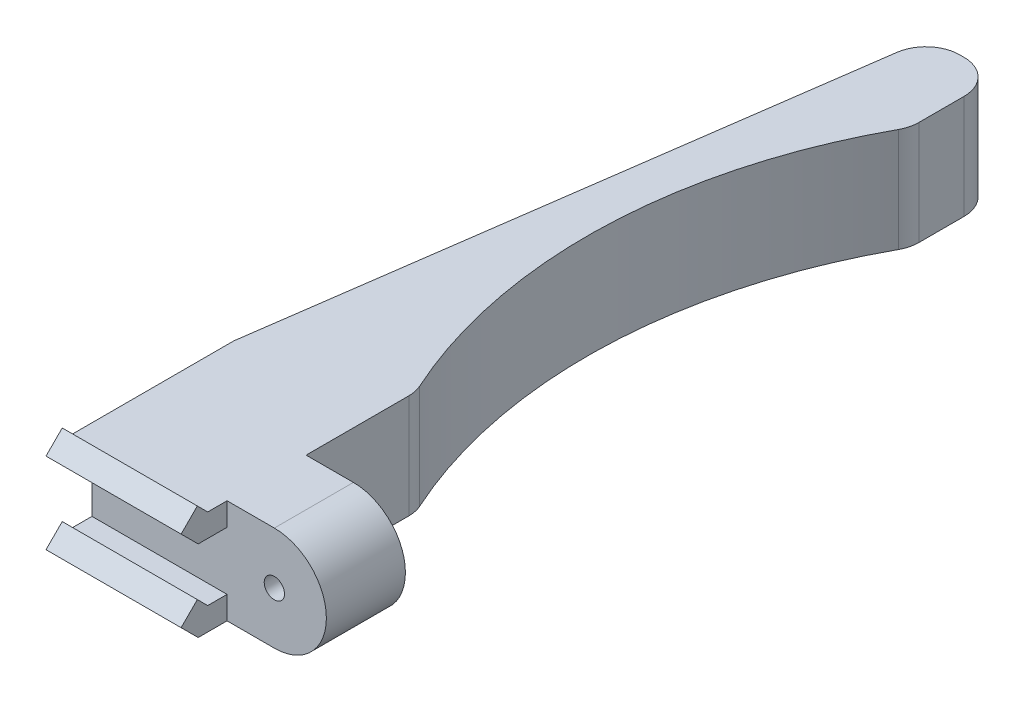
ISO-10303-21;
HEADER;
FILE_DESCRIPTION(('STEP AP214'),'2;1');
FILE_NAME('part.step','',(''),(''),'','','');
FILE_SCHEMA(('AUTOMOTIVE_DESIGN { 1 0 10303 214 1 1 1 1 }'));
ENDSEC;
DATA;
#1=APPLICATION_CONTEXT('core data for automotive mechanical design processes');
#2=APPLICATION_PROTOCOL_DEFINITION('international standard','automotive_design',2000,#1);
#3=PRODUCT_CONTEXT('',#1,'mechanical');
#4=PRODUCT('Part','Part','',(#3));
#5=PRODUCT_RELATED_PRODUCT_CATEGORY('part','',(#4));
#6=PRODUCT_DEFINITION_FORMATION('','',#4);
#7=PRODUCT_DEFINITION_CONTEXT('part definition',#1,'design');
#8=PRODUCT_DEFINITION('design','',#6,#7);
#9=PRODUCT_DEFINITION_SHAPE('','',#8);
#10=(LENGTH_UNIT() NAMED_UNIT(*) SI_UNIT(.MILLI.,.METRE.));
#11=(NAMED_UNIT(*) PLANE_ANGLE_UNIT() SI_UNIT($,.RADIAN.));
#12=(NAMED_UNIT(*) SI_UNIT($,.STERADIAN.) SOLID_ANGLE_UNIT());
#13=UNCERTAINTY_MEASURE_WITH_UNIT(LENGTH_MEASURE(1.E-05),#10,'distance_accuracy_value','');
#14=(GEOMETRIC_REPRESENTATION_CONTEXT(3) GLOBAL_UNCERTAINTY_ASSIGNED_CONTEXT((#13)) GLOBAL_UNIT_ASSIGNED_CONTEXT((#10,
#11,#12)) REPRESENTATION_CONTEXT('',''));
#15=CARTESIAN_POINT('',(0.,0.,0.));
#16=DIRECTION('',(0.,0.,1.));
#17=DIRECTION('',(1.,0.,0.));
#18=AXIS2_PLACEMENT_3D('',#15,#16,#17);
#19=CARTESIAN_POINT('',(5.,-7.38420621970652,2.5));
#20=DIRECTION('',(-1.,0.,0.));
#21=DIRECTION('',(0.,0.,1.));
#22=AXIS2_PLACEMENT_3D('',#19,#20,#21);
#23=PLANE('',#22);
#24=DIRECTION('',(0.,-1.,0.));
#25=VECTOR('',#24,1.);
#26=CARTESIAN_POINT('',(4.99999999999998,-2.80336880465984,2.5));
#27=LINE('',#26,#25);
#28=CARTESIAN_POINT('',(5.,4.89663119534016,2.5));
#29=VERTEX_POINT('',#28);
#30=CARTESIAN_POINT('',(5.,3.19663119534017,2.5));
#31=VERTEX_POINT('',#30);
#32=EDGE_CURVE('E223',#29,#31,#27,.T.);
#33=ORIENTED_EDGE('',*,*,#32,.F.);
#34=DIRECTION('',(0.,0.,1.));
#35=VECTOR('',#34,1.);
#36=CARTESIAN_POINT('',(5.,4.89663119534016,2.64999999999731));
#37=LINE('',#36,#35);
#38=CARTESIAN_POINT('',(5.,4.89663119534016,3.93370490960709));
#39=VERTEX_POINT('',#38);
#40=EDGE_CURVE('E295',#29,#39,#37,.T.);
#41=ORIENTED_EDGE('',*,*,#40,.T.);
#42=DIRECTION('',(0.,0.707106781186547,0.707106781186547));
#43=VECTOR('',#42,1.);
#44=CARTESIAN_POINT('',(5.,4.89663119534016,3.93370490960709));
#45=LINE('',#44,#43);
#46=CARTESIAN_POINT('',(5.,5.66292628573039,4.69999999999731));
#47=VERTEX_POINT('',#46);
#48=EDGE_CURVE('E307',#39,#47,#45,.T.);
#49=ORIENTED_EDGE('',*,*,#48,.T.);
#50=DIRECTION('',(0.,-0.707106781186548,0.707106781186547));
#51=VECTOR('',#50,1.);
#52=CARTESIAN_POINT('',(5.,5.66292628573039,4.69999999999731));
#53=LINE('',#52,#51);
#54=CARTESIAN_POINT('',(5.,4.46084475771326,5.90208152801444));
#55=VERTEX_POINT('',#54);
#56=EDGE_CURVE('E310',#47,#55,#53,.T.);
#57=ORIENTED_EDGE('',*,*,#56,.T.);
#58=DIRECTION('',(0.,-0.707106781186547,-0.707106781186548));
#59=VECTOR('',#58,1.);
#60=CARTESIAN_POINT('',(5.,4.46084475771326,5.90208152801444));
#61=LINE('',#60,#59);
#62=CARTESIAN_POINT('',(5.,3.19663119534016,4.63786796564135));
#63=VERTEX_POINT('',#62);
#64=EDGE_CURVE('E313',#55,#63,#61,.T.);
#65=ORIENTED_EDGE('',*,*,#64,.T.);
#66=DIRECTION('',(0.,0.,-1.));
#67=VECTOR('',#66,1.);
#68=CARTESIAN_POINT('',(5.,3.19663119534017,2.5));
#69=LINE('',#68,#67);
#70=EDGE_CURVE('E316',#63,#31,#69,.T.);
#71=ORIENTED_EDGE('',*,*,#70,.T.);
#72=EDGE_LOOP('',(#33,#41,#49,#57,#65,#71));
#73=FACE_BOUND('',#72,.T.);
#74=ADVANCED_FACE('F33',(#73),#23,.F.);
#75=CARTESIAN_POINT('',(5.,-1.10336880465984,2.5));
#76=VERTEX_POINT('',#75);
#77=CARTESIAN_POINT('',(5.,-2.80336880465984,2.49999999999994));
#78=VERTEX_POINT('',#77);
#79=EDGE_CURVE('E227',#76,#78,#27,.T.);
#80=ORIENTED_EDGE('',*,*,#79,.F.);
#81=DIRECTION('',(0.,0.,1.));
#82=VECTOR('',#81,1.);
#83=CARTESIAN_POINT('',(5.,-1.10336880465984,2.64999999999725));
#84=LINE('',#83,#82);
#85=CARTESIAN_POINT('',(5.,-1.10336880465984,3.93370490960702));
#86=VERTEX_POINT('',#85);
#87=EDGE_CURVE('E254',#76,#86,#84,.T.);
#88=ORIENTED_EDGE('',*,*,#87,.T.);
#89=DIRECTION('',(0.,0.707106781186547,0.707106781186547));
#90=VECTOR('',#89,1.);
#91=CARTESIAN_POINT('',(5.,-1.10336880465984,3.93370490960702));
#92=LINE('',#91,#90);
#93=CARTESIAN_POINT('',(5.,-0.337073714269612,4.69999999999725));
#94=VERTEX_POINT('',#93);
#95=EDGE_CURVE('E275',#86,#94,#92,.T.);
#96=ORIENTED_EDGE('',*,*,#95,.T.);
#97=DIRECTION('',(0.,-0.707106781186548,0.707106781186547));
#98=VECTOR('',#97,1.);
#99=CARTESIAN_POINT('',(5.,-0.337073714269612,4.69999999999725));
#100=LINE('',#99,#98);
#101=CARTESIAN_POINT('',(5.,-1.53915524228674,5.90208152801438));
#102=VERTEX_POINT('',#101);
#103=EDGE_CURVE('E278',#94,#102,#100,.T.);
#104=ORIENTED_EDGE('',*,*,#103,.T.);
#105=DIRECTION('',(0.,-0.707106781186547,-0.707106781186548));
#106=VECTOR('',#105,1.);
#107=CARTESIAN_POINT('',(5.,-1.53915524228674,5.90208152801438));
#108=LINE('',#107,#106);
#109=CARTESIAN_POINT('',(5.,-2.80336880465984,4.63786796564128));
#110=VERTEX_POINT('',#109);
#111=EDGE_CURVE('E200',#102,#110,#108,.T.);
#112=ORIENTED_EDGE('',*,*,#111,.T.);
#113=DIRECTION('',(0.,0.,-1.));
#114=VECTOR('',#113,1.);
#115=CARTESIAN_POINT('',(5.,-2.80336880465984,2.49999999999994));
#116=LINE('',#115,#114);
#117=EDGE_CURVE('E199',#110,#78,#116,.T.);
#118=ORIENTED_EDGE('',*,*,#117,.T.);
#119=EDGE_LOOP('',(#80,#88,#96,#104,#112,#118));
#120=FACE_BOUND('',#119,.T.);
#121=ADVANCED_FACE('F429',(#120),#23,.F.);
#122=CARTESIAN_POINT('',(0.,0.,2.5));
#123=DIRECTION('',(0.,0.,-1.));
#124=DIRECTION('',(-1.,0.,0.));
#125=AXIS2_PLACEMENT_3D('',#122,#123,#124);
#126=PLANE('',#125);
#127=DIRECTION('',(0.,-1.,0.));
#128=VECTOR('',#127,1.);
#129=CARTESIAN_POINT('',(-5.,-7.38420621970652,2.5));
#130=LINE('',#129,#128);
#131=CARTESIAN_POINT('',(-5.,3.19663119534017,2.5));
#132=VERTEX_POINT('',#131);
#133=CARTESIAN_POINT('',(-5.,-1.10336880465984,2.5));
#134=VERTEX_POINT('',#133);
#135=EDGE_CURVE('E330',#132,#134,#130,.T.);
#136=ORIENTED_EDGE('',*,*,#135,.T.);
#137=DIRECTION('',(1.,0.,0.));
#138=VECTOR('',#137,1.);
#139=CARTESIAN_POINT('',(-9.20199597764443,-1.10336880465984,2.49999999999994));
#140=LINE('',#139,#138);
#141=EDGE_CURVE('E283',#134,#76,#140,.T.);
#142=ORIENTED_EDGE('',*,*,#141,.T.);
#143=ORIENTED_EDGE('',*,*,#79,.T.);
#144=DIRECTION('',(1.,0.,0.));
#145=VECTOR('',#144,1.);
#146=CARTESIAN_POINT('',(8.49999999999999,-2.80336880465984,2.5));
#147=LINE('',#146,#145);
#148=CARTESIAN_POINT('',(8.49999999999998,-2.80336880465984,2.5));
#149=VERTEX_POINT('',#148);
#150=EDGE_CURVE('E226',#78,#149,#147,.T.);
#151=ORIENTED_EDGE('',*,*,#150,.T.);
#152=CARTESIAN_POINT('',(8.49999999999998,1.04663119534016,2.5));
#153=DIRECTION('',(0.,0.,1.));
#154=DIRECTION('',(-1.,0.,0.));
#155=AXIS2_PLACEMENT_3D('',#152,#153,#154);
#156=CIRCLE('',#155,3.85);
#157=CARTESIAN_POINT('',(8.49999999999998,4.89663119534016,2.5));
#158=VERTEX_POINT('',#157);
#159=EDGE_CURVE('E230',#149,#158,#156,.T.);
#160=ORIENTED_EDGE('',*,*,#159,.T.);
#161=DIRECTION('',(-1.,0.,0.));
#162=VECTOR('',#161,1.);
#163=CARTESIAN_POINT('',(5.,4.89663119534016,2.5));
#164=LINE('',#163,#162);
#165=EDGE_CURVE('E210',#158,#29,#164,.T.);
#166=ORIENTED_EDGE('',*,*,#165,.T.);
#167=ORIENTED_EDGE('',*,*,#32,.T.);
#168=DIRECTION('',(1.,0.,0.));
#169=VECTOR('',#168,1.);
#170=CARTESIAN_POINT('',(-9.20199597764443,3.19663119534017,2.5));
#171=LINE('',#170,#169);
#172=EDGE_CURVE('E299',#132,#31,#171,.T.);
#173=ORIENTED_EDGE('',*,*,#172,.F.);
#174=EDGE_LOOP('',(#136,#142,#143,#151,#160,#166,#167,#173));
#175=FACE_BOUND('',#174,.T.);
#176=CARTESIAN_POINT('',(8.49999999999998,1.04663119534016,2.5));
#177=DIRECTION('',(0.,0.,1.));
#178=DIRECTION('',(1.,0.,0.));
#179=AXIS2_PLACEMENT_3D('',#176,#177,#178);
#180=CIRCLE('',#179,0.75);
#181=CARTESIAN_POINT('',(9.24999999999998,1.04663119534016,2.5));
#182=VERTEX_POINT('',#181);
#183=EDGE_CURVE('E420',#182,#182,#180,.T.);
#184=ORIENTED_EDGE('',*,*,#183,.F.);
#185=EDGE_LOOP('',(#184));
#186=FACE_BOUND('',#185,.T.);
#187=ADVANCED_FACE('F407',(#175,#186),#126,.F.);
#188=CARTESIAN_POINT('',(4.99999999999998,-2.80336880465984,-3.35));
#189=VERTEX_POINT('',#188);
#190=CARTESIAN_POINT('',(5.,-2.80336880465987,-10.9501334916828));
#191=VERTEX_POINT('',#190);
#192=EDGE_CURVE('E189',#189,#191,#116,.T.);
#193=ORIENTED_EDGE('',*,*,#192,.T.);
#194=DIRECTION('',(0.,1.,0.));
#195=VECTOR('',#194,1.);
#196=CARTESIAN_POINT('',(5.,4.89663119534017,-10.9501334916829));
#197=LINE('',#196,#195);
#198=CARTESIAN_POINT('',(5.,4.89663119534016,-10.9501334916829));
#199=VERTEX_POINT('',#198);
#200=EDGE_CURVE('E11',#191,#199,#197,.T.);
#201=ORIENTED_EDGE('',*,*,#200,.T.);
#202=CARTESIAN_POINT('',(5.,4.89663119534016,-3.35));
#203=VERTEX_POINT('',#202);
#204=EDGE_CURVE('E206',#199,#203,#37,.T.);
#205=ORIENTED_EDGE('',*,*,#204,.T.);
#206=DIRECTION('',(0.,-1.,0.));
#207=VECTOR('',#206,1.);
#208=CARTESIAN_POINT('',(4.99999999999998,-2.80336880465984,-3.35));
#209=LINE('',#208,#207);
#210=EDGE_CURVE('E203',#203,#189,#209,.T.);
#211=ORIENTED_EDGE('',*,*,#210,.T.);
#212=EDGE_LOOP('',(#193,#201,#205,#211));
#213=FACE_BOUND('',#212,.T.);
#214=ADVANCED_FACE('F204',(#213),#23,.F.);
#215=CARTESIAN_POINT('',(-5.,-7.38420621970652,2.5));
#216=DIRECTION('',(1.,0.,0.));
#217=DIRECTION('',(0.,0.,-1.));
#218=AXIS2_PLACEMENT_3D('',#215,#216,#217);
#219=PLANE('',#218);
#220=DIRECTION('',(0.,0.,-1.));
#221=VECTOR('',#220,1.);
#222=CARTESIAN_POINT('',(-5.,4.89663119534016,2.64999999999731));
#223=LINE('',#222,#221);
#224=CARTESIAN_POINT('',(-5.,4.89663119534016,3.93370490960709));
#225=VERTEX_POINT('',#224);
#226=CARTESIAN_POINT('',(-5.,4.89663119534016,-8.00000000000017));
#227=VERTEX_POINT('',#226);
#228=EDGE_CURVE('E305',#225,#227,#223,.T.);
#229=ORIENTED_EDGE('',*,*,#228,.T.);
#230=DIRECTION('',(0.,-1.,0.));
#231=VECTOR('',#230,1.);
#232=CARTESIAN_POINT('',(-5.,56.8520738748096,-8.00000000000017));
#233=LINE('',#232,#231);
#234=CARTESIAN_POINT('',(-5.,-2.80336880465987,-8.));
#235=VERTEX_POINT('',#234);
#236=EDGE_CURVE('E258',#227,#235,#233,.T.);
#237=ORIENTED_EDGE('',*,*,#236,.T.);
#238=DIRECTION('',(0.,0.,1.));
#239=VECTOR('',#238,1.);
#240=CARTESIAN_POINT('',(-5.,-2.80336880465984,2.49999999999994));
#241=LINE('',#240,#239);
#242=CARTESIAN_POINT('',(-5.,-2.80336880465984,4.63786796564128));
#243=VERTEX_POINT('',#242);
#244=EDGE_CURVE('E270',#235,#243,#241,.T.);
#245=ORIENTED_EDGE('',*,*,#244,.T.);
#246=DIRECTION('',(0.,0.707106781186547,0.707106781186548));
#247=VECTOR('',#246,1.);
#248=CARTESIAN_POINT('',(-5.,-1.53915524228674,5.90208152801438));
#249=LINE('',#248,#247);
#250=CARTESIAN_POINT('',(-5.,-1.53915524228674,5.90208152801438));
#251=VERTEX_POINT('',#250);
#252=EDGE_CURVE('E268',#243,#251,#249,.T.);
#253=ORIENTED_EDGE('',*,*,#252,.T.);
#254=DIRECTION('',(0.,0.707106781186548,-0.707106781186547));
#255=VECTOR('',#254,1.);
#256=CARTESIAN_POINT('',(-5.,-0.337073714269612,4.69999999999725));
#257=LINE('',#256,#255);
#258=CARTESIAN_POINT('',(-5.,-0.337073714269613,4.69999999999725));
#259=VERTEX_POINT('',#258);
#260=EDGE_CURVE('E265',#251,#259,#257,.T.);
#261=ORIENTED_EDGE('',*,*,#260,.T.);
#262=DIRECTION('',(0.,-0.707106781186548,-0.707106781186548));
#263=VECTOR('',#262,1.);
#264=CARTESIAN_POINT('',(-5.,-1.10336880465984,3.93370490960702));
#265=LINE('',#264,#263);
#266=CARTESIAN_POINT('',(-5.,-1.10336880465984,3.93370490960702));
#267=VERTEX_POINT('',#266);
#268=EDGE_CURVE('E263',#259,#267,#265,.T.);
#269=ORIENTED_EDGE('',*,*,#268,.T.);
#270=DIRECTION('',(0.,0.,-1.));
#271=VECTOR('',#270,1.);
#272=CARTESIAN_POINT('',(-5.,-1.10336880465984,2.64999999999725));
#273=LINE('',#272,#271);
#274=EDGE_CURVE('E272',#267,#134,#273,.T.);
#275=ORIENTED_EDGE('',*,*,#274,.T.);
#276=ORIENTED_EDGE('',*,*,#135,.F.);
#277=DIRECTION('',(0.,0.,1.));
#278=VECTOR('',#277,1.);
#279=CARTESIAN_POINT('',(-5.,3.19663119534017,2.5));
#280=LINE('',#279,#278);
#281=CARTESIAN_POINT('',(-5.,3.19663119534017,4.63786796564135));
#282=VERTEX_POINT('',#281);
#283=EDGE_CURVE('E303',#132,#282,#280,.T.);
#284=ORIENTED_EDGE('',*,*,#283,.T.);
#285=DIRECTION('',(0.,0.707106781186547,0.707106781186548));
#286=VECTOR('',#285,1.);
#287=CARTESIAN_POINT('',(-5.,4.46084475771326,5.90208152801444));
#288=LINE('',#287,#286);
#289=CARTESIAN_POINT('',(-5.,4.46084475771326,5.90208152801444));
#290=VERTEX_POINT('',#289);
#291=EDGE_CURVE('E301',#282,#290,#288,.T.);
#292=ORIENTED_EDGE('',*,*,#291,.T.);
#293=DIRECTION('',(0.,0.707106781186548,-0.707106781186547));
#294=VECTOR('',#293,1.);
#295=CARTESIAN_POINT('',(-5.,5.66292628573039,4.69999999999731));
#296=LINE('',#295,#294);
#297=CARTESIAN_POINT('',(-5.,5.66292628573039,4.69999999999731));
#298=VERTEX_POINT('',#297);
#299=EDGE_CURVE('E298',#290,#298,#296,.T.);
#300=ORIENTED_EDGE('',*,*,#299,.T.);
#301=DIRECTION('',(0.,-0.707106781186548,-0.707106781186548));
#302=VECTOR('',#301,1.);
#303=CARTESIAN_POINT('',(-5.,4.89663119534016,3.93370490960709));
#304=LINE('',#303,#302);
#305=EDGE_CURVE('E296',#298,#225,#304,.T.);
#306=ORIENTED_EDGE('',*,*,#305,.T.);
#307=EDGE_LOOP('',(#229,#237,#245,#253,#261,#269,#275,#276,#284,#292,#300,#306));
#308=FACE_BOUND('',#307,.T.);
#309=ADVANCED_FACE('F393',(#308),#219,.F.);
#310=CARTESIAN_POINT('',(-9.20199597764443,3.19663119534017,2.5));
#311=DIRECTION('',(0.,-1.,0.));
#312=DIRECTION('',(0.,0.,-1.));
#313=AXIS2_PLACEMENT_3D('',#310,#311,#312);
#314=PLANE('',#313);
#315=ORIENTED_EDGE('',*,*,#283,.F.);
#316=ORIENTED_EDGE('',*,*,#172,.T.);
#317=ORIENTED_EDGE('',*,*,#70,.F.);
#318=DIRECTION('',(1.,0.,0.));
#319=VECTOR('',#318,1.);
#320=CARTESIAN_POINT('',(-9.20199597764443,3.19663119534016,4.63786796564135));
#321=LINE('',#320,#319);
#322=EDGE_CURVE('E321',#282,#63,#321,.T.);
#323=ORIENTED_EDGE('',*,*,#322,.F.);
#324=EDGE_LOOP('',(#315,#316,#317,#323));
#325=FACE_BOUND('',#324,.T.);
#326=ADVANCED_FACE('F576',(#325),#314,.T.);
#327=CARTESIAN_POINT('',(-9.20199597764443,4.46084475771326,5.90208152801444));
#328=DIRECTION('',(0.,-0.707106781186548,0.707106781186547));
#329=DIRECTION('',(0.,-0.707106781186547,-0.707106781186548));
#330=AXIS2_PLACEMENT_3D('',#327,#328,#329);
#331=PLANE('',#330);
#332=ORIENTED_EDGE('',*,*,#291,.F.);
#333=ORIENTED_EDGE('',*,*,#322,.T.);
#334=ORIENTED_EDGE('',*,*,#64,.F.);
#335=DIRECTION('',(1.,0.,0.));
#336=VECTOR('',#335,1.);
#337=CARTESIAN_POINT('',(-9.20199597764443,4.46084475771326,5.90208152801444));
#338=LINE('',#337,#336);
#339=EDGE_CURVE('E323',#290,#55,#338,.T.);
#340=ORIENTED_EDGE('',*,*,#339,.F.);
#341=EDGE_LOOP('',(#332,#333,#334,#340));
#342=FACE_BOUND('',#341,.T.);
#343=ADVANCED_FACE('F580',(#342),#331,.T.);
#344=CARTESIAN_POINT('',(-9.20199597764443,5.66292628573039,4.69999999999731));
#345=DIRECTION('',(0.,0.707106781186547,0.707106781186548));
#346=DIRECTION('',(0.,-0.707106781186548,0.707106781186547));
#347=AXIS2_PLACEMENT_3D('',#344,#345,#346);
#348=PLANE('',#347);
#349=ORIENTED_EDGE('',*,*,#299,.F.);
#350=ORIENTED_EDGE('',*,*,#339,.T.);
#351=ORIENTED_EDGE('',*,*,#56,.F.);
#352=DIRECTION('',(1.,0.,0.));
#353=VECTOR('',#352,1.);
#354=CARTESIAN_POINT('',(-9.20199597764443,5.66292628573039,4.69999999999731));
#355=LINE('',#354,#353);
#356=EDGE_CURVE('E325',#298,#47,#355,.T.);
#357=ORIENTED_EDGE('',*,*,#356,.F.);
#358=EDGE_LOOP('',(#349,#350,#351,#357));
#359=FACE_BOUND('',#358,.T.);
#360=ADVANCED_FACE('F643',(#359),#348,.T.);
#361=CARTESIAN_POINT('',(-9.20199597764443,4.89663119534016,3.93370490960709));
#362=DIRECTION('',(0.,0.707106781186547,-0.707106781186547));
#363=DIRECTION('',(0.,0.707106781186548,0.707106781186548));
#364=AXIS2_PLACEMENT_3D('',#361,#362,#363);
#365=PLANE('',#364);
#366=ORIENTED_EDGE('',*,*,#305,.F.);
#367=ORIENTED_EDGE('',*,*,#356,.T.);
#368=ORIENTED_EDGE('',*,*,#48,.F.);
#369=DIRECTION('',(1.,0.,0.));
#370=VECTOR('',#369,1.);
#371=CARTESIAN_POINT('',(-9.20199597764443,4.89663119534016,3.93370490960709));
#372=LINE('',#371,#370);
#373=EDGE_CURVE('E319',#225,#39,#372,.T.);
#374=ORIENTED_EDGE('',*,*,#373,.F.);
#375=EDGE_LOOP('',(#366,#367,#368,#374));
#376=FACE_BOUND('',#375,.T.);
#377=ADVANCED_FACE('F401',(#376),#365,.T.);
#378=CARTESIAN_POINT('',(-9.20199597764443,4.89663119534016,2.64999999999731));
#379=DIRECTION('',(0.,1.,0.));
#380=DIRECTION('',(0.,0.,1.));
#381=AXIS2_PLACEMENT_3D('',#378,#379,#380);
#382=PLANE('',#381);
#383=DIRECTION('',(1.,0.,0.));
#384=VECTOR('',#383,1.);
#385=CARTESIAN_POINT('',(1.35244572854812,4.89663119534016,-53.2));
#386=LINE('',#385,#384);
#387=CARTESIAN_POINT('',(3.52566257308868,4.89663119534016,-53.2));
#388=VERTEX_POINT('',#387);
#389=CARTESIAN_POINT('',(3.85244572854812,4.89663119534016,-53.2));
#390=VERTEX_POINT('',#389);
#391=EDGE_CURVE('E251',#388,#390,#386,.T.);
#392=ORIENTED_EDGE('',*,*,#391,.F.);
#393=CARTESIAN_POINT('',(3.52566257308868,4.89663119534017,-50.7));
#394=DIRECTION('',(0.,1.,0.));
#395=DIRECTION('',(0.,0.,1.));
#396=AXIS2_PLACEMENT_3D('',#393,#394,#395);
#397=CIRCLE('',#396,2.5);
#398=CARTESIAN_POINT('',(1.04999240123476,4.89663119534017,-51.0479327524002));
#399=VERTEX_POINT('',#398);
#400=EDGE_CURVE('E352',#388,#399,#397,.T.);
#401=ORIENTED_EDGE('',*,*,#400,.T.);
#402=DIRECTION('',(0.139173100960066,0.,-0.99026806874157));
#403=VECTOR('',#402,1.);
#404=CARTESIAN_POINT('',(-4.99999999999998,4.89663119534017,-8.00000000000017));
#405=LINE('',#404,#403);
#406=EDGE_CURVE('E255',#227,#399,#405,.T.);
#407=ORIENTED_EDGE('',*,*,#406,.F.);
#408=ORIENTED_EDGE('',*,*,#228,.F.);
#409=ORIENTED_EDGE('',*,*,#373,.T.);
#410=ORIENTED_EDGE('',*,*,#40,.F.);
#411=ORIENTED_EDGE('',*,*,#165,.F.);
#412=DIRECTION('',(0.,0.,1.));
#413=VECTOR('',#412,1.);
#414=CARTESIAN_POINT('',(8.49999999999998,4.89663119534016,-3.35));
#415=LINE('',#414,#413);
#416=CARTESIAN_POINT('',(8.49999999999998,4.89663119534016,-3.35));
#417=VERTEX_POINT('',#416);
#418=EDGE_CURVE('E235',#417,#158,#415,.T.);
#419=ORIENTED_EDGE('',*,*,#418,.F.);
#420=DIRECTION('',(-1.,0.,0.));
#421=VECTOR('',#420,1.);
#422=CARTESIAN_POINT('',(5.,4.89663119534016,-3.35));
#423=LINE('',#422,#421);
#424=EDGE_CURVE('E217',#417,#203,#423,.T.);
#425=ORIENTED_EDGE('',*,*,#424,.T.);
#426=ORIENTED_EDGE('',*,*,#204,.F.);
#427=CARTESIAN_POINT('',(2.5,4.89663119534016,-10.9501334916829));
#428=DIRECTION('',(0.,1.,0.));
#429=DIRECTION('',(0.,0.,1.));
#430=AXIS2_PLACEMENT_3D('',#427,#428,#429);
#431=CIRCLE('',#430,2.5);
#432=CARTESIAN_POINT('',(4.77641433795368,4.89663119534017,-11.9835442338173));
#433=VERTEX_POINT('',#432);
#434=EDGE_CURVE('E347',#199,#433,#431,.T.);
#435=ORIENTED_EDGE('',*,*,#434,.T.);
#436=CARTESIAN_POINT('',(39.6088986863946,4.89663119534017,-27.7962470888115));
#437=DIRECTION('',(0.,1.,0.));
#438=DIRECTION('',(0.,0.,1.));
#439=AXIS2_PLACEMENT_3D('',#436,#437,#438);
#440=CIRCLE('',#439,38.2536735159477);
#441=CARTESIAN_POINT('',(6.04589541498277,4.89663119534017,-46.1502207421631));
#442=VERTEX_POINT('',#441);
#443=EDGE_CURVE('E250',#442,#433,#440,.T.);
#444=ORIENTED_EDGE('',*,*,#443,.F.);
#445=CARTESIAN_POINT('',(3.85244572854811,4.89663119534017,-47.3497116646296));
#446=DIRECTION('',(0.,1.,0.));
#447=DIRECTION('',(0.,0.,1.));
#448=AXIS2_PLACEMENT_3D('',#445,#446,#447);
#449=CIRCLE('',#448,2.5);
#450=CARTESIAN_POINT('',(6.35244572854812,4.89663119534016,-47.3497116646296));
#451=VERTEX_POINT('',#450);
#452=EDGE_CURVE('E48',#442,#451,#449,.T.);
#453=ORIENTED_EDGE('',*,*,#452,.T.);
#454=DIRECTION('',(0.,0.,1.));
#455=VECTOR('',#454,1.);
#456=CARTESIAN_POINT('',(6.35244572854812,4.89663119534016,-53.2000000000002));
#457=LINE('',#456,#455);
#458=CARTESIAN_POINT('',(6.35244572854812,4.89663119534016,-50.7));
#459=VERTEX_POINT('',#458);
#460=EDGE_CURVE('E241',#459,#451,#457,.T.);
#461=ORIENTED_EDGE('',*,*,#460,.F.);
#462=CARTESIAN_POINT('',(3.85244572854812,4.89663119534017,-50.7));
#463=DIRECTION('',(0.,1.,0.));
#464=DIRECTION('',(0.,0.,1.));
#465=AXIS2_PLACEMENT_3D('',#462,#463,#464);
#466=CIRCLE('',#465,2.5);
#467=EDGE_CURVE('E350',#459,#390,#466,.T.);
#468=ORIENTED_EDGE('',*,*,#467,.T.);
#469=EDGE_LOOP('',(#392,#401,#407,#408,#409,#410,#411,#419,#425,#426,#435,#444,#453,#461,#468));
#470=FACE_BOUND('',#469,.T.);
#471=ADVANCED_FACE('F367',(#470),#382,.T.);
#472=CARTESIAN_POINT('',(-9.20199597764443,-2.80336880465984,2.49999999999994));
#473=DIRECTION('',(0.,-1.,0.));
#474=DIRECTION('',(0.,0.,-1.));
#475=AXIS2_PLACEMENT_3D('',#472,#473,#474);
#476=PLANE('',#475);
#477=DIRECTION('',(0.139173100960066,0.,-0.99026806874157));
#478=VECTOR('',#477,1.);
#479=CARTESIAN_POINT('',(-5.,-2.80336880465987,-8.));
#480=LINE('',#479,#478);
#481=CARTESIAN_POINT('',(1.04999240123476,-2.80336880465999,-51.0479327524002));
#482=VERTEX_POINT('',#481);
#483=EDGE_CURVE('E239',#235,#482,#480,.T.);
#484=ORIENTED_EDGE('',*,*,#483,.T.);
#485=CARTESIAN_POINT('',(3.52566257308868,-2.80336880465999,-50.7));
#486=DIRECTION('',(0.,-1.,0.));
#487=DIRECTION('',(0.,0.,-1.));
#488=AXIS2_PLACEMENT_3D('',#485,#486,#487);
#489=CIRCLE('',#488,2.5);
#490=CARTESIAN_POINT('',(3.52566257308868,-2.80336880466,-53.2));
#491=VERTEX_POINT('',#490);
#492=EDGE_CURVE('E340',#482,#491,#489,.T.);
#493=ORIENTED_EDGE('',*,*,#492,.T.);
#494=DIRECTION('',(1.,0.,0.));
#495=VECTOR('',#494,1.);
#496=CARTESIAN_POINT('',(1.35244572854812,-2.80336880466,-53.2));
#497=LINE('',#496,#495);
#498=CARTESIAN_POINT('',(3.85244572854812,-2.80336880466,-53.2));
#499=VERTEX_POINT('',#498);
#500=EDGE_CURVE('E237',#491,#499,#497,.T.);
#501=ORIENTED_EDGE('',*,*,#500,.T.);
#502=CARTESIAN_POINT('',(3.85244572854812,-2.80336880465999,-50.7));
#503=DIRECTION('',(0.,-1.,0.));
#504=DIRECTION('',(0.,0.,-1.));
#505=AXIS2_PLACEMENT_3D('',#502,#503,#504);
#506=CIRCLE('',#505,2.5);
#507=CARTESIAN_POINT('',(6.35244572854812,-2.80336880465999,-50.7));
#508=VERTEX_POINT('',#507);
#509=EDGE_CURVE('E338',#499,#508,#506,.T.);
#510=ORIENTED_EDGE('',*,*,#509,.T.);
#511=DIRECTION('',(0.,0.,1.));
#512=VECTOR('',#511,1.);
#513=CARTESIAN_POINT('',(6.35244572854812,-2.80336880466,-53.2));
#514=LINE('',#513,#512);
#515=CARTESIAN_POINT('',(6.35244572854812,-2.80336880465998,-47.3497116646296));
#516=VERTEX_POINT('',#515);
#517=EDGE_CURVE('E244',#508,#516,#514,.T.);
#518=ORIENTED_EDGE('',*,*,#517,.T.);
#519=CARTESIAN_POINT('',(3.85244572854811,-2.80336880465998,-47.3497116646296));
#520=DIRECTION('',(0.,-1.,0.));
#521=DIRECTION('',(0.,0.,-1.));
#522=AXIS2_PLACEMENT_3D('',#519,#520,#521);
#523=CIRCLE('',#522,2.5);
#524=CARTESIAN_POINT('',(6.04589541498278,-2.80336880465998,-46.1502207421631));
#525=VERTEX_POINT('',#524);
#526=EDGE_CURVE('E336',#516,#525,#523,.T.);
#527=ORIENTED_EDGE('',*,*,#526,.T.);
#528=CARTESIAN_POINT('',(39.6088986863946,-2.80336880465992,-27.7962470888115));
#529=DIRECTION('',(0.,1.,0.));
#530=DIRECTION('',(0.,0.,-1.));
#531=AXIS2_PLACEMENT_3D('',#528,#529,#530);
#532=CIRCLE('',#531,38.2536735159477);
#533=CARTESIAN_POINT('',(4.77641433795368,-2.80336880465988,-11.9835442338173));
#534=VERTEX_POINT('',#533);
#535=EDGE_CURVE('E242',#525,#534,#532,.T.);
#536=ORIENTED_EDGE('',*,*,#535,.T.);
#537=CARTESIAN_POINT('',(2.5,-2.80336880465987,-10.9501334916828));
#538=DIRECTION('',(0.,-1.,0.));
#539=DIRECTION('',(0.,0.,-1.));
#540=AXIS2_PLACEMENT_3D('',#537,#538,#539);
#541=CIRCLE('',#540,2.5);
#542=EDGE_CURVE('E196',#534,#191,#541,.T.);
#543=ORIENTED_EDGE('',*,*,#542,.T.);
#544=ORIENTED_EDGE('',*,*,#192,.F.);
#545=DIRECTION('',(1.,0.,0.));
#546=VECTOR('',#545,1.);
#547=CARTESIAN_POINT('',(8.49999999999999,-2.80336880465984,-3.35));
#548=LINE('',#547,#546);
#549=CARTESIAN_POINT('',(8.49999999999998,-2.80336880465984,-3.35));
#550=VERTEX_POINT('',#549);
#551=EDGE_CURVE('E194',#189,#550,#548,.T.);
#552=ORIENTED_EDGE('',*,*,#551,.T.);
#553=DIRECTION('',(0.,0.,1.));
#554=VECTOR('',#553,1.);
#555=CARTESIAN_POINT('',(8.49999999999998,-2.80336880465984,-3.35));
#556=LINE('',#555,#554);
#557=EDGE_CURVE('E222',#550,#149,#556,.T.);
#558=ORIENTED_EDGE('',*,*,#557,.T.);
#559=ORIENTED_EDGE('',*,*,#150,.F.);
#560=ORIENTED_EDGE('',*,*,#117,.F.);
#561=DIRECTION('',(1.,0.,0.));
#562=VECTOR('',#561,1.);
#563=CARTESIAN_POINT('',(-9.20199597764443,-2.80336880465984,4.63786796564128));
#564=LINE('',#563,#562);
#565=EDGE_CURVE('E266',#243,#110,#564,.T.);
#566=ORIENTED_EDGE('',*,*,#565,.F.);
#567=ORIENTED_EDGE('',*,*,#244,.F.);
#568=EDGE_LOOP('',(#484,#493,#501,#510,#518,#527,#536,#543,#544,#552,#558,#559,#560,#566,#567));
#569=FACE_BOUND('',#568,.T.);
#570=ADVANCED_FACE('F192',(#569),#476,.T.);
#571=CARTESIAN_POINT('',(-9.20199597764443,-1.53915524228674,5.90208152801438));
#572=DIRECTION('',(0.,-0.707106781186548,0.707106781186547));
#573=DIRECTION('',(0.,-0.707106781186547,-0.707106781186548));
#574=AXIS2_PLACEMENT_3D('',#571,#572,#573);
#575=PLANE('',#574);
#576=ORIENTED_EDGE('',*,*,#252,.F.);
#577=ORIENTED_EDGE('',*,*,#565,.T.);
#578=ORIENTED_EDGE('',*,*,#111,.F.);
#579=DIRECTION('',(1.,0.,0.));
#580=VECTOR('',#579,1.);
#581=CARTESIAN_POINT('',(-9.20199597764443,-1.53915524228674,5.90208152801438));
#582=LINE('',#581,#580);
#583=EDGE_CURVE('E285',#251,#102,#582,.T.);
#584=ORIENTED_EDGE('',*,*,#583,.F.);
#585=EDGE_LOOP('',(#576,#577,#578,#584));
#586=FACE_BOUND('',#585,.T.);
#587=ADVANCED_FACE('F516',(#586),#575,.T.);
#588=CARTESIAN_POINT('',(-9.20199597764443,-0.337073714269612,4.69999999999725));
#589=DIRECTION('',(0.,0.707106781186547,0.707106781186548));
#590=DIRECTION('',(0.,-0.707106781186548,0.707106781186547));
#591=AXIS2_PLACEMENT_3D('',#588,#589,#590);
#592=PLANE('',#591);
#593=ORIENTED_EDGE('',*,*,#260,.F.);
#594=ORIENTED_EDGE('',*,*,#583,.T.);
#595=ORIENTED_EDGE('',*,*,#103,.F.);
#596=DIRECTION('',(1.,0.,0.));
#597=VECTOR('',#596,1.);
#598=CARTESIAN_POINT('',(-9.20199597764443,-0.337073714269612,4.69999999999725));
#599=LINE('',#598,#597);
#600=EDGE_CURVE('E287',#259,#94,#599,.T.);
#601=ORIENTED_EDGE('',*,*,#600,.F.);
#602=EDGE_LOOP('',(#593,#594,#595,#601));
#603=FACE_BOUND('',#602,.T.);
#604=ADVANCED_FACE('F616',(#603),#592,.T.);
#605=CARTESIAN_POINT('',(-9.20199597764443,-1.10336880465984,3.93370490960702));
#606=DIRECTION('',(0.,0.707106781186547,-0.707106781186547));
#607=DIRECTION('',(0.,0.707106781186548,0.707106781186548));
#608=AXIS2_PLACEMENT_3D('',#605,#606,#607);
#609=PLANE('',#608);
#610=ORIENTED_EDGE('',*,*,#268,.F.);
#611=ORIENTED_EDGE('',*,*,#600,.T.);
#612=ORIENTED_EDGE('',*,*,#95,.F.);
#613=DIRECTION('',(1.,0.,0.));
#614=VECTOR('',#613,1.);
#615=CARTESIAN_POINT('',(-9.20199597764443,-1.10336880465984,3.93370490960702));
#616=LINE('',#615,#614);
#617=EDGE_CURVE('E289',#267,#86,#616,.T.);
#618=ORIENTED_EDGE('',*,*,#617,.F.);
#619=EDGE_LOOP('',(#610,#611,#612,#618));
#620=FACE_BOUND('',#619,.T.);
#621=ADVANCED_FACE('F567',(#620),#609,.T.);
#622=CARTESIAN_POINT('',(-9.20199597764443,-1.10336880465984,2.64999999999725));
#623=DIRECTION('',(0.,1.,0.));
#624=DIRECTION('',(0.,0.,1.));
#625=AXIS2_PLACEMENT_3D('',#622,#623,#624);
#626=PLANE('',#625);
#627=ORIENTED_EDGE('',*,*,#274,.F.);
#628=ORIENTED_EDGE('',*,*,#617,.T.);
#629=ORIENTED_EDGE('',*,*,#87,.F.);
#630=ORIENTED_EDGE('',*,*,#141,.F.);
#631=EDGE_LOOP('',(#627,#628,#629,#630));
#632=FACE_BOUND('',#631,.T.);
#633=ADVANCED_FACE('F505',(#632),#626,.T.);
#634=CARTESIAN_POINT('',(6.35244572854812,56.8520738748095,-53.2000000000002));
#635=DIRECTION('',(1.,0.,0.));
#636=DIRECTION('',(0.,0.,-1.));
#637=AXIS2_PLACEMENT_3D('',#634,#635,#636);
#638=PLANE('',#637);
#639=ORIENTED_EDGE('',*,*,#517,.F.);
#640=DIRECTION('',(0.,-1.,0.));
#641=VECTOR('',#640,1.);
#642=CARTESIAN_POINT('',(6.35244572854812,56.8520738748095,-50.7000000000002));
#643=LINE('',#642,#641);
#644=EDGE_CURVE('E55',#508,#459,#643,.F.);
#645=ORIENTED_EDGE('',*,*,#644,.T.);
#646=ORIENTED_EDGE('',*,*,#460,.T.);
#647=DIRECTION('',(0.,-1.,0.));
#648=VECTOR('',#647,1.);
#649=CARTESIAN_POINT('',(6.35244572854812,56.8520738748095,-47.3497116646298));
#650=LINE('',#649,#648);
#651=EDGE_CURVE('E354',#451,#516,#650,.T.);
#652=ORIENTED_EDGE('',*,*,#651,.T.);
#653=EDGE_LOOP('',(#639,#645,#646,#652));
#654=FACE_BOUND('',#653,.T.);
#655=ADVANCED_FACE('F371',(#654),#638,.T.);
#656=CARTESIAN_POINT('',(39.6088986863946,56.8520738748096,-27.7962470888117));
#657=DIRECTION('',(0.,-1.,0.));
#658=DIRECTION('',(0.,0.,-1.));
#659=AXIS2_PLACEMENT_3D('',#656,#657,#658);
#660=CYLINDRICAL_SURFACE('',#659,38.2536735159477);
#661=ORIENTED_EDGE('',*,*,#535,.F.);
#662=DIRECTION('',(0.,-1.,0.));
#663=VECTOR('',#662,1.);
#664=CARTESIAN_POINT('',(6.04589541498277,56.8520738748095,-46.1502207421632));
#665=LINE('',#664,#663);
#666=EDGE_CURVE('E41',#525,#442,#665,.F.);
#667=ORIENTED_EDGE('',*,*,#666,.T.);
#668=ORIENTED_EDGE('',*,*,#443,.T.);
#669=DIRECTION('',(0.,-1.,0.));
#670=VECTOR('',#669,1.);
#671=CARTESIAN_POINT('',(4.77641433795367,56.8520738748096,-11.9835442338175));
#672=LINE('',#671,#670);
#673=EDGE_CURVE('E358',#433,#534,#672,.T.);
#674=ORIENTED_EDGE('',*,*,#673,.T.);
#675=EDGE_LOOP('',(#661,#667,#668,#674));
#676=FACE_BOUND('',#675,.T.);
#677=ADVANCED_FACE('F363',(#676),#660,.F.);
#678=CARTESIAN_POINT('',(-5.,56.8520738748096,-8.00000000000017));
#679=DIRECTION('',(-0.99026806874157,0.,-0.139173100960066));
#680=DIRECTION('',(-0.139173100960066,0.,0.99026806874157));
#681=AXIS2_PLACEMENT_3D('',#678,#679,#680);
#682=PLANE('',#681);
#683=ORIENTED_EDGE('',*,*,#406,.T.);
#684=DIRECTION('',(0.,-1.,0.));
#685=VECTOR('',#684,1.);
#686=CARTESIAN_POINT('',(1.04999240123476,56.8520738748095,-51.0479327524003));
#687=LINE('',#686,#685);
#688=EDGE_CURVE('E332',#399,#482,#687,.T.);
#689=ORIENTED_EDGE('',*,*,#688,.T.);
#690=ORIENTED_EDGE('',*,*,#483,.F.);
#691=ORIENTED_EDGE('',*,*,#236,.F.);
#692=EDGE_LOOP('',(#683,#689,#690,#691));
#693=FACE_BOUND('',#692,.T.);
#694=ADVANCED_FACE('F387',(#693),#682,.T.);
#695=CARTESIAN_POINT('',(1.35244572854812,56.8520738748095,-53.2000000000002));
#696=DIRECTION('',(0.,0.,-1.));
#697=DIRECTION('',(0.,1.,0.));
#698=AXIS2_PLACEMENT_3D('',#695,#696,#697);
#699=PLANE('',#698);
#700=ORIENTED_EDGE('',*,*,#500,.F.);
#701=DIRECTION('',(0.,-1.,0.));
#702=VECTOR('',#701,1.);
#703=CARTESIAN_POINT('',(3.52566257308868,56.8520738748095,-53.2000000000002));
#704=LINE('',#703,#702);
#705=EDGE_CURVE('E345',#491,#388,#704,.F.);
#706=ORIENTED_EDGE('',*,*,#705,.T.);
#707=ORIENTED_EDGE('',*,*,#391,.T.);
#708=DIRECTION('',(0.,-1.,0.));
#709=VECTOR('',#708,1.);
#710=CARTESIAN_POINT('',(3.85244572854812,56.8520738748095,-53.2000000000002));
#711=LINE('',#710,#709);
#712=EDGE_CURVE('E342',#390,#499,#711,.T.);
#713=ORIENTED_EDGE('',*,*,#712,.T.);
#714=EDGE_LOOP('',(#700,#706,#707,#713));
#715=FACE_BOUND('',#714,.T.);
#716=ADVANCED_FACE('F378',(#715),#699,.T.);
#717=CARTESIAN_POINT('',(8.49999999999998,1.04663119534016,-3.35));
#718=DIRECTION('',(0.,0.,1.));
#719=DIRECTION('',(1.,0.,0.));
#720=AXIS2_PLACEMENT_3D('',#717,#718,#719);
#721=CYLINDRICAL_SURFACE('',#720,3.85);
#722=ORIENTED_EDGE('',*,*,#159,.F.);
#723=ORIENTED_EDGE('',*,*,#557,.F.);
#724=CARTESIAN_POINT('',(8.49999999999998,1.04663119534016,-3.35));
#725=DIRECTION('',(0.,0.,1.));
#726=DIRECTION('',(-1.,0.,0.));
#727=AXIS2_PLACEMENT_3D('',#724,#725,#726);
#728=CIRCLE('',#727,3.85);
#729=EDGE_CURVE('E215',#550,#417,#728,.T.);
#730=ORIENTED_EDGE('',*,*,#729,.T.);
#731=ORIENTED_EDGE('',*,*,#418,.T.);
#732=EDGE_LOOP('',(#722,#723,#730,#731));
#733=FACE_BOUND('',#732,.T.);
#734=ADVANCED_FACE('F412',(#733),#721,.T.);
#735=CARTESIAN_POINT('',(8.49999999999998,1.04663119534016,-3.35));
#736=DIRECTION('',(0.,0.,-1.));
#737=DIRECTION('',(-1.,0.,0.));
#738=AXIS2_PLACEMENT_3D('',#735,#736,#737);
#739=PLANE('',#738);
#740=CARTESIAN_POINT('',(8.49999999999998,1.04663119534016,-3.35));
#741=DIRECTION('',(0.,0.,1.));
#742=DIRECTION('',(1.,0.,0.));
#743=AXIS2_PLACEMENT_3D('',#740,#741,#742);
#744=CIRCLE('',#743,0.75);
#745=CARTESIAN_POINT('',(9.24999999999998,1.04663119534016,-3.35));
#746=VERTEX_POINT('',#745);
#747=EDGE_CURVE('E418',#746,#746,#744,.T.);
#748=ORIENTED_EDGE('',*,*,#747,.T.);
#749=EDGE_LOOP('',(#748));
#750=FACE_BOUND('',#749,.T.);
#751=ORIENTED_EDGE('',*,*,#210,.F.);
#752=ORIENTED_EDGE('',*,*,#424,.F.);
#753=ORIENTED_EDGE('',*,*,#729,.F.);
#754=ORIENTED_EDGE('',*,*,#551,.F.);
#755=EDGE_LOOP('',(#751,#752,#753,#754));
#756=FACE_BOUND('',#755,.T.);
#757=ADVANCED_FACE('F213',(#750,#756),#739,.T.);
#758=CARTESIAN_POINT('',(8.49999999999998,1.04663119534016,-3.35));
#759=DIRECTION('',(0.,0.,1.));
#760=DIRECTION('',(1.,0.,0.));
#761=AXIS2_PLACEMENT_3D('',#758,#759,#760);
#762=CYLINDRICAL_SURFACE('',#761,0.75);
#763=ORIENTED_EDGE('',*,*,#747,.F.);
#764=EDGE_LOOP('',(#763));
#765=FACE_BOUND('',#764,.T.);
#766=ORIENTED_EDGE('',*,*,#183,.T.);
#767=EDGE_LOOP('',(#766));
#768=FACE_BOUND('',#767,.T.);
#769=ADVANCED_FACE('F427',(#765,#768),#762,.F.);
#770=CARTESIAN_POINT('',(3.52566257308868,56.8520738748095,-50.7000000000002));
#771=DIRECTION('',(0.,-1.,0.));
#772=DIRECTION('',(0.,0.,-1.));
#773=AXIS2_PLACEMENT_3D('',#770,#771,#772);
#774=CYLINDRICAL_SURFACE('',#773,2.5);
#775=ORIENTED_EDGE('',*,*,#400,.F.);
#776=ORIENTED_EDGE('',*,*,#705,.F.);
#777=ORIENTED_EDGE('',*,*,#492,.F.);
#778=ORIENTED_EDGE('',*,*,#688,.F.);
#779=EDGE_LOOP('',(#775,#776,#777,#778));
#780=FACE_BOUND('',#779,.T.);
#781=ADVANCED_FACE('F384',(#780),#774,.T.);
#782=CARTESIAN_POINT('',(3.85244572854812,56.8520738748095,-50.7000000000002));
#783=DIRECTION('',(0.,-1.,0.));
#784=DIRECTION('',(0.,0.,-1.));
#785=AXIS2_PLACEMENT_3D('',#782,#783,#784);
#786=CYLINDRICAL_SURFACE('',#785,2.5);
#787=ORIENTED_EDGE('',*,*,#467,.F.);
#788=ORIENTED_EDGE('',*,*,#644,.F.);
#789=ORIENTED_EDGE('',*,*,#509,.F.);
#790=ORIENTED_EDGE('',*,*,#712,.F.);
#791=EDGE_LOOP('',(#787,#788,#789,#790));
#792=FACE_BOUND('',#791,.T.);
#793=ADVANCED_FACE('F376',(#792),#786,.T.);
#794=CARTESIAN_POINT('',(3.85244572854811,56.8520738748095,-47.3497116646298));
#795=DIRECTION('',(0.,-1.,0.));
#796=DIRECTION('',(0.,0.,-1.));
#797=AXIS2_PLACEMENT_3D('',#794,#795,#796);
#798=CYLINDRICAL_SURFACE('',#797,2.5);
#799=ORIENTED_EDGE('',*,*,#452,.F.);
#800=ORIENTED_EDGE('',*,*,#666,.F.);
#801=ORIENTED_EDGE('',*,*,#526,.F.);
#802=ORIENTED_EDGE('',*,*,#651,.F.);
#803=EDGE_LOOP('',(#799,#800,#801,#802));
#804=FACE_BOUND('',#803,.T.);
#805=ADVANCED_FACE('F370',(#804),#798,.T.);
#806=CARTESIAN_POINT('',(2.5,56.8520738748096,-10.950133491683));
#807=DIRECTION('',(0.,-1.,0.));
#808=DIRECTION('',(0.,0.,-1.));
#809=AXIS2_PLACEMENT_3D('',#806,#807,#808);
#810=CYLINDRICAL_SURFACE('',#809,2.5);
#811=ORIENTED_EDGE('',*,*,#434,.F.);
#812=ORIENTED_EDGE('',*,*,#200,.F.);
#813=ORIENTED_EDGE('',*,*,#542,.F.);
#814=ORIENTED_EDGE('',*,*,#673,.F.);
#815=EDGE_LOOP('',(#811,#812,#813,#814));
#816=FACE_BOUND('',#815,.T.);
#817=ADVANCED_FACE('F35',(#816),#810,.T.);
#818=CLOSED_SHELL('',(#74,#121,#187,#214,#309,#326,#343,#360,#377,#471,#570,#587,#604,#621,#633,
#655,#677,#694,#716,#734,#757,#769,#781,#793,#805,#817));
#819=MANIFOLD_SOLID_BREP('B2',#818);
#820=ADVANCED_BREP_SHAPE_REPRESENTATION('',(#18,#819),#14);
#821=SHAPE_DEFINITION_REPRESENTATION(#9,#820);
ENDSEC;
END-ISO-10303-21;
